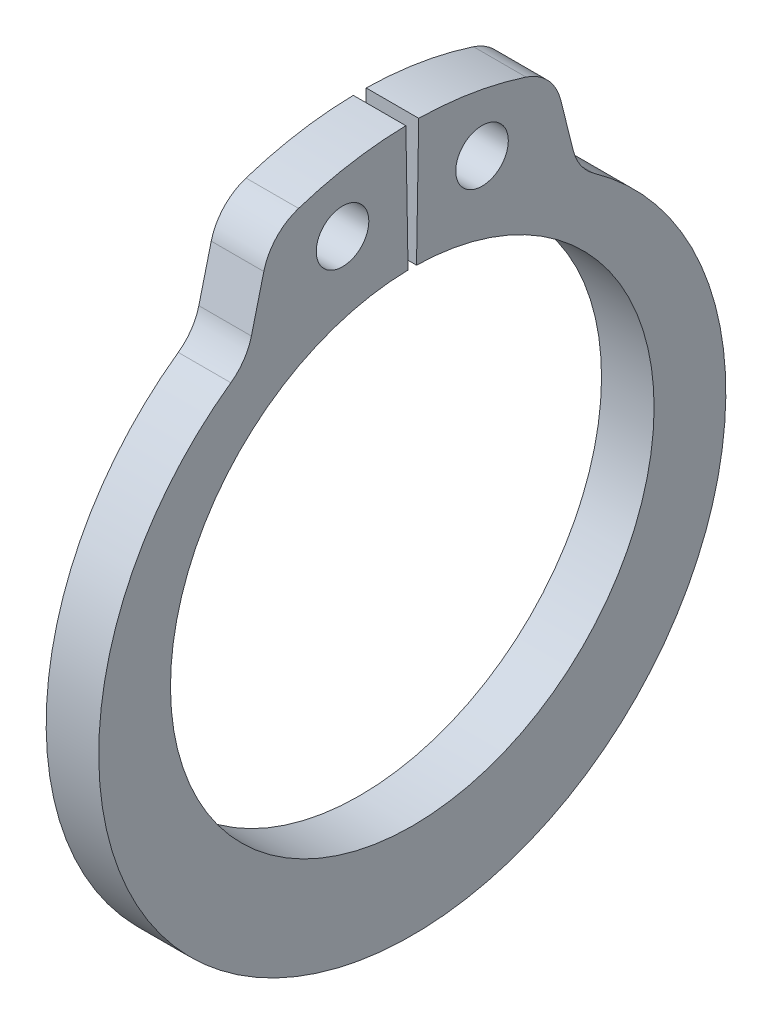
ISO-10303-21;
HEADER;
FILE_DESCRIPTION(('STEP AP214'),'2;1');
FILE_NAME('part.step','',(''),(''),'','','');
FILE_SCHEMA(('AUTOMOTIVE_DESIGN { 1 0 10303 214 1 1 1 1 }'));
ENDSEC;
DATA;
#1=APPLICATION_CONTEXT('core data for automotive mechanical design processes');
#2=APPLICATION_PROTOCOL_DEFINITION('international standard','automotive_design',2000,#1);
#3=PRODUCT_CONTEXT('',#1,'mechanical');
#4=PRODUCT('Part','Part','',(#3));
#5=PRODUCT_RELATED_PRODUCT_CATEGORY('part','',(#4));
#6=PRODUCT_DEFINITION_FORMATION('','',#4);
#7=PRODUCT_DEFINITION_CONTEXT('part definition',#1,'design');
#8=PRODUCT_DEFINITION('design','',#6,#7);
#9=PRODUCT_DEFINITION_SHAPE('','',#8);
#10=(LENGTH_UNIT() NAMED_UNIT(*) SI_UNIT(.MILLI.,.METRE.));
#11=(NAMED_UNIT(*) PLANE_ANGLE_UNIT() SI_UNIT($,.RADIAN.));
#12=(NAMED_UNIT(*) SI_UNIT($,.STERADIAN.) SOLID_ANGLE_UNIT());
#13=UNCERTAINTY_MEASURE_WITH_UNIT(LENGTH_MEASURE(1.E-05),#10,'distance_accuracy_value','');
#14=(GEOMETRIC_REPRESENTATION_CONTEXT(3) GLOBAL_UNCERTAINTY_ASSIGNED_CONTEXT((#13)) GLOBAL_UNIT_ASSIGNED_CONTEXT((#10,
#11,#12)) REPRESENTATION_CONTEXT('',''));
#15=CARTESIAN_POINT('',(0.,0.,0.));
#16=DIRECTION('',(0.,0.,1.));
#17=DIRECTION('',(1.,0.,0.));
#18=AXIS2_PLACEMENT_3D('',#15,#16,#17);
#19=CARTESIAN_POINT('',(0.635,0.,0.));
#20=DIRECTION('',(1.,0.,0.));
#21=DIRECTION('',(0.,0.,-1.));
#22=AXIS2_PLACEMENT_3D('',#19,#20,#21);
#23=PLANE('',#22);
#24=CARTESIAN_POINT('',(0.635,7.33771049478929,1.68498677622097));
#25=DIRECTION('',(1.,0.,0.));
#26=DIRECTION('',(0.,0.,-1.));
#27=AXIS2_PLACEMENT_3D('',#24,#25,#26);
#28=CIRCLE('',#27,0.635);
#29=CARTESIAN_POINT('',(0.635,7.33771049478929,1.04998677622097));
#30=VERTEX_POINT('',#29);
#31=EDGE_CURVE('E218',#30,#30,#28,.T.);
#32=ORIENTED_EDGE('',*,*,#31,.F.);
#33=EDGE_LOOP('',(#32));
#34=FACE_BOUND('',#33,.T.);
#35=CARTESIAN_POINT('',(0.635,0.,0.));
#36=DIRECTION('',(1.,0.,0.));
#37=DIRECTION('',(0.,0.,-1.));
#38=AXIS2_PLACEMENT_3D('',#35,#36,#37);
#39=CIRCLE('',#38,8.88999999999998);
#40=CARTESIAN_POINT('',(0.635,8.88864600994031,0.155151893227452));
#41=VERTEX_POINT('',#40);
#42=CARTESIAN_POINT('',(0.635,8.45481975457244,2.74738474147533));
#43=VERTEX_POINT('',#42);
#44=EDGE_CURVE('E135',#41,#43,#39,.T.);
#45=ORIENTED_EDGE('',*,*,#44,.T.);
#46=CARTESIAN_POINT('',(0.635,7.24698836106209,2.35490120697885));
#47=DIRECTION('',(1.,0.,0.));
#48=DIRECTION('',(0.,0.,-1.));
#49=AXIS2_PLACEMENT_3D('',#46,#47,#48);
#50=CIRCLE('',#49,1.27);
#51=CARTESIAN_POINT('',(0.635,7.55422916847366,3.58717677934937));
#52=VERTEX_POINT('',#51);
#53=EDGE_CURVE('E172',#43,#52,#50,.T.);
#54=ORIENTED_EDGE('',*,*,#53,.T.);
#55=DIRECTION('',(0.,-0.970295726275998,0.241921895599661));
#56=VECTOR('',#55,1.);
#57=CARTESIAN_POINT('',(0.635,8.20363873719473,3.4252607885529));
#58=LINE('',#57,#56);
#59=CARTESIAN_POINT('',(0.635,6.35349195006748,3.88655419195405));
#60=VERTEX_POINT('',#59);
#61=EDGE_CURVE('E210',#52,#60,#58,.T.);
#62=ORIENTED_EDGE('',*,*,#61,.T.);
#63=CARTESIAN_POINT('',(0.635,6.66073275747905,5.11882976432457));
#64=DIRECTION('',(1.,0.,0.));
#65=DIRECTION('',(0.,0.,-1.));
#66=AXIS2_PLACEMENT_3D('',#63,#64,#65);
#67=CIRCLE('',#66,1.27);
#68=CARTESIAN_POINT('',(0.635,5.6250079501203,4.38386437505669));
#69=VERTEX_POINT('',#68);
#70=EDGE_CURVE('E183',#60,#69,#67,.F.);
#71=ORIENTED_EDGE('',*,*,#70,.T.);
#72=CARTESIAN_POINT('',(0.635,-0.552802803479046,0.));
#73=DIRECTION('',(1.,0.,0.));
#74=DIRECTION('',(0.,0.,-1.));
#75=AXIS2_PLACEMENT_3D('',#72,#73,#74);
#76=CIRCLE('',#75,7.57519719652095);
#77=CARTESIAN_POINT('',(0.635,5.62500795012011,-4.38386437505695));
#78=VERTEX_POINT('',#77);
#79=EDGE_CURVE('E205',#69,#78,#76,.T.);
#80=ORIENTED_EDGE('',*,*,#79,.T.);
#81=CARTESIAN_POINT('',(0.635,6.66073275747883,-5.11882976432488));
#82=DIRECTION('',(1.,0.,0.));
#83=DIRECTION('',(0.,0.,-1.));
#84=AXIS2_PLACEMENT_3D('',#81,#82,#83);
#85=CIRCLE('',#84,1.27);
#86=CARTESIAN_POINT('',(0.635,6.35349195006709,-3.8865541919544));
#87=VERTEX_POINT('',#86);
#88=EDGE_CURVE('E11',#78,#87,#85,.F.);
#89=ORIENTED_EDGE('',*,*,#88,.T.);
#90=DIRECTION('',(0.,0.970295726275966,0.24192189559979));
#91=VECTOR('',#90,1.);
#92=CARTESIAN_POINT('',(0.635,8.20363873719474,-3.42526078855289));
#93=LINE('',#92,#91);
#94=CARTESIAN_POINT('',(0.635,7.55422916847373,-3.58717677934944));
#95=VERTEX_POINT('',#94);
#96=EDGE_CURVE('E204',#87,#95,#93,.T.);
#97=ORIENTED_EDGE('',*,*,#96,.T.);
#98=CARTESIAN_POINT('',(0.635,7.24698836106199,-2.35490120697896));
#99=DIRECTION('',(1.,0.,0.));
#100=DIRECTION('',(0.,0.,-1.));
#101=AXIS2_PLACEMENT_3D('',#98,#99,#100);
#102=CIRCLE('',#101,1.27);
#103=CARTESIAN_POINT('',(0.635,8.45481975457237,-2.74738474147536));
#104=VERTEX_POINT('',#103);
#105=EDGE_CURVE('E50',#95,#104,#102,.T.);
#106=ORIENTED_EDGE('',*,*,#105,.T.);
#107=CARTESIAN_POINT('',(0.635,-5.25968157916168E-12,1.06620441642225E-12));
#108=DIRECTION('',(1.,0.,0.));
#109=DIRECTION('',(0.,0.,1.));
#110=AXIS2_PLACEMENT_3D('',#107,#108,#109);
#111=CIRCLE('',#110,8.89000000000527);
#112=CARTESIAN_POINT('',(0.635,8.88864600994031,-0.155151893227453));
#113=VERTEX_POINT('',#112);
#114=EDGE_CURVE('E207',#104,#113,#111,.T.);
#115=ORIENTED_EDGE('',*,*,#114,.T.);
#116=DIRECTION('',(0.,-0.999847695156391,0.0174524064372838));
#117=VECTOR('',#116,1.);
#118=CARTESIAN_POINT('',(0.635,8.88864600994031,-0.155151893227452));
#119=LINE('',#118,#117);
#120=CARTESIAN_POINT('',(0.635,5.84111023510362,-0.101956958406611));
#121=VERTEX_POINT('',#120);
#122=EDGE_CURVE('E141',#113,#121,#119,.T.);
#123=ORIENTED_EDGE('',*,*,#122,.T.);
#124=CARTESIAN_POINT('',(0.635,0.,0.));
#125=DIRECTION('',(-1.,0.,0.));
#126=DIRECTION('',(0.,0.,-1.));
#127=AXIS2_PLACEMENT_3D('',#124,#125,#126);
#128=CIRCLE('',#127,5.84199999999999);
#129=CARTESIAN_POINT('',(0.635,5.84111023510362,0.101956958406611));
#130=VERTEX_POINT('',#129);
#131=EDGE_CURVE('E136',#121,#130,#128,.T.);
#132=ORIENTED_EDGE('',*,*,#131,.T.);
#133=DIRECTION('',(0.,0.999847695156391,0.0174524064372838));
#134=VECTOR('',#133,1.);
#135=CARTESIAN_POINT('',(0.635,5.84111023510362,0.101956958406611));
#136=LINE('',#135,#134);
#137=EDGE_CURVE('E125',#130,#41,#136,.T.);
#138=ORIENTED_EDGE('',*,*,#137,.T.);
#139=EDGE_LOOP('',(#45,#54,#62,#71,#80,#89,#97,#106,#115,#123,#132,#138));
#140=FACE_BOUND('',#139,.T.);
#141=CARTESIAN_POINT('',(0.635,7.33771049478929,-1.68498677622097));
#142=DIRECTION('',(1.,0.,0.));
#143=DIRECTION('',(0.,0.,-1.));
#144=AXIS2_PLACEMENT_3D('',#141,#142,#143);
#145=CIRCLE('',#144,0.635);
#146=CARTESIAN_POINT('',(0.635,7.33771049478929,-2.31998677622097));
#147=VERTEX_POINT('',#146);
#148=EDGE_CURVE('E247',#147,#147,#145,.T.);
#149=ORIENTED_EDGE('',*,*,#148,.F.);
#150=EDGE_LOOP('',(#149));
#151=FACE_BOUND('',#150,.T.);
#152=ADVANCED_FACE('F35',(#34,#140,#151),#23,.T.);
#153=CARTESIAN_POINT('',(-0.635,0.,0.));
#154=DIRECTION('',(1.,0.,0.));
#155=DIRECTION('',(0.,0.,-1.));
#156=AXIS2_PLACEMENT_3D('',#153,#154,#155);
#157=PLANE('',#156);
#158=CARTESIAN_POINT('',(-0.635,7.33771049478929,1.68498677622097));
#159=DIRECTION('',(1.,0.,0.));
#160=DIRECTION('',(0.,0.,-1.));
#161=AXIS2_PLACEMENT_3D('',#158,#159,#160);
#162=CIRCLE('',#161,0.635);
#163=CARTESIAN_POINT('',(-0.635,7.33771049478929,1.04998677622097));
#164=VERTEX_POINT('',#163);
#165=EDGE_CURVE('E244',#164,#164,#162,.T.);
#166=ORIENTED_EDGE('',*,*,#165,.T.);
#167=EDGE_LOOP('',(#166));
#168=FACE_BOUND('',#167,.T.);
#169=DIRECTION('',(0.,-0.970295726275998,0.241921895599661));
#170=VECTOR('',#169,1.);
#171=CARTESIAN_POINT('',(-0.635,8.20363873719473,3.4252607885529));
#172=LINE('',#171,#170);
#173=CARTESIAN_POINT('',(-0.635,7.55422916847366,3.58717677934937));
#174=VERTEX_POINT('',#173);
#175=CARTESIAN_POINT('',(-0.635,6.35349195006748,3.88655419195405));
#176=VERTEX_POINT('',#175);
#177=EDGE_CURVE('E201',#174,#176,#172,.T.);
#178=ORIENTED_EDGE('',*,*,#177,.F.);
#179=CARTESIAN_POINT('',(-0.635,7.24698836106209,2.35490120697885));
#180=DIRECTION('',(1.,0.,0.));
#181=DIRECTION('',(0.,0.,-1.));
#182=AXIS2_PLACEMENT_3D('',#179,#180,#181);
#183=CIRCLE('',#182,1.27);
#184=CARTESIAN_POINT('',(-0.635,8.45481975457244,2.74738474147533));
#185=VERTEX_POINT('',#184);
#186=EDGE_CURVE('E167',#174,#185,#183,.F.);
#187=ORIENTED_EDGE('',*,*,#186,.T.);
#188=CARTESIAN_POINT('',(-0.635,0.,0.));
#189=DIRECTION('',(1.,0.,0.));
#190=DIRECTION('',(0.,0.,-1.));
#191=AXIS2_PLACEMENT_3D('',#188,#189,#190);
#192=CIRCLE('',#191,8.88999999999998);
#193=CARTESIAN_POINT('',(-0.635,8.88864600994031,0.155151893227452));
#194=VERTEX_POINT('',#193);
#195=EDGE_CURVE('E220',#194,#185,#192,.T.);
#196=ORIENTED_EDGE('',*,*,#195,.F.);
#197=DIRECTION('',(0.,0.999847695156391,0.0174524064372838));
#198=VECTOR('',#197,1.);
#199=CARTESIAN_POINT('',(-0.635,5.84111023510362,0.101956958406611));
#200=LINE('',#199,#198);
#201=CARTESIAN_POINT('',(-0.635,5.84111023510362,0.101956958406611));
#202=VERTEX_POINT('',#201);
#203=EDGE_CURVE('E217',#202,#194,#200,.T.);
#204=ORIENTED_EDGE('',*,*,#203,.F.);
#205=CARTESIAN_POINT('',(-0.635,0.,0.));
#206=DIRECTION('',(-1.,0.,0.));
#207=DIRECTION('',(0.,0.,-1.));
#208=AXIS2_PLACEMENT_3D('',#205,#206,#207);
#209=CIRCLE('',#208,5.84199999999999);
#210=CARTESIAN_POINT('',(-0.635,5.84111023510362,-0.101956958406611));
#211=VERTEX_POINT('',#210);
#212=EDGE_CURVE('E149',#211,#202,#209,.T.);
#213=ORIENTED_EDGE('',*,*,#212,.F.);
#214=DIRECTION('',(0.,-0.999847695156391,0.0174524064372838));
#215=VECTOR('',#214,1.);
#216=CARTESIAN_POINT('',(-0.635,8.88864600994031,-0.155151893227452));
#217=LINE('',#216,#215);
#218=CARTESIAN_POINT('',(-0.635,8.88864600994031,-0.155151893227453));
#219=VERTEX_POINT('',#218);
#220=EDGE_CURVE('E145',#219,#211,#217,.T.);
#221=ORIENTED_EDGE('',*,*,#220,.F.);
#222=CARTESIAN_POINT('',(-0.635,-5.25968157916168E-12,1.06620441642225E-12));
#223=DIRECTION('',(1.,0.,0.));
#224=DIRECTION('',(0.,0.,1.));
#225=AXIS2_PLACEMENT_3D('',#222,#223,#224);
#226=CIRCLE('',#225,8.89000000000527);
#227=CARTESIAN_POINT('',(-0.635,8.45481975457237,-2.74738474147536));
#228=VERTEX_POINT('',#227);
#229=EDGE_CURVE('E226',#228,#219,#226,.T.);
#230=ORIENTED_EDGE('',*,*,#229,.F.);
#231=CARTESIAN_POINT('',(-0.635,7.24698836106199,-2.35490120697896));
#232=DIRECTION('',(1.,0.,0.));
#233=DIRECTION('',(0.,0.,-1.));
#234=AXIS2_PLACEMENT_3D('',#231,#232,#233);
#235=CIRCLE('',#234,1.27);
#236=CARTESIAN_POINT('',(-0.635,7.55422916847373,-3.58717677934944));
#237=VERTEX_POINT('',#236);
#238=EDGE_CURVE('E165',#228,#237,#235,.F.);
#239=ORIENTED_EDGE('',*,*,#238,.T.);
#240=DIRECTION('',(0.,0.970295726275966,0.24192189559979));
#241=VECTOR('',#240,1.);
#242=CARTESIAN_POINT('',(-0.635,8.20363873719474,-3.42526078855289));
#243=LINE('',#242,#241);
#244=CARTESIAN_POINT('',(-0.635,6.35349195006709,-3.8865541919544));
#245=VERTEX_POINT('',#244);
#246=EDGE_CURVE('E192',#245,#237,#243,.T.);
#247=ORIENTED_EDGE('',*,*,#246,.F.);
#248=CARTESIAN_POINT('',(-0.635,6.66073275747883,-5.11882976432488));
#249=DIRECTION('',(1.,0.,0.));
#250=DIRECTION('',(0.,0.,-1.));
#251=AXIS2_PLACEMENT_3D('',#248,#249,#250);
#252=CIRCLE('',#251,1.27);
#253=CARTESIAN_POINT('',(-0.635,5.62500795012011,-4.38386437505695));
#254=VERTEX_POINT('',#253);
#255=EDGE_CURVE('E43',#245,#254,#252,.T.);
#256=ORIENTED_EDGE('',*,*,#255,.T.);
#257=CARTESIAN_POINT('',(-0.635,-0.552802803479046,0.));
#258=DIRECTION('',(1.,0.,0.));
#259=DIRECTION('',(0.,0.,-1.));
#260=AXIS2_PLACEMENT_3D('',#257,#258,#259);
#261=CIRCLE('',#260,7.57519719652095);
#262=CARTESIAN_POINT('',(-0.635,5.6250079501203,4.38386437505669));
#263=VERTEX_POINT('',#262);
#264=EDGE_CURVE('E191',#263,#254,#261,.T.);
#265=ORIENTED_EDGE('',*,*,#264,.F.);
#266=CARTESIAN_POINT('',(-0.635,6.66073275747905,5.11882976432457));
#267=DIRECTION('',(1.,0.,0.));
#268=DIRECTION('',(0.,0.,-1.));
#269=AXIS2_PLACEMENT_3D('',#266,#267,#268);
#270=CIRCLE('',#269,1.27);
#271=EDGE_CURVE('E181',#263,#176,#270,.T.);
#272=ORIENTED_EDGE('',*,*,#271,.T.);
#273=EDGE_LOOP('',(#178,#187,#196,#204,#213,#221,#230,#239,#247,#256,#265,#272));
#274=FACE_BOUND('',#273,.T.);
#275=CARTESIAN_POINT('',(-0.635,7.33771049478929,-1.68498677622097));
#276=DIRECTION('',(1.,0.,0.));
#277=DIRECTION('',(0.,0.,-1.));
#278=AXIS2_PLACEMENT_3D('',#275,#276,#277);
#279=CIRCLE('',#278,0.635);
#280=CARTESIAN_POINT('',(-0.635,7.33771049478929,-2.31998677622097));
#281=VERTEX_POINT('',#280);
#282=EDGE_CURVE('E250',#281,#281,#279,.T.);
#283=ORIENTED_EDGE('',*,*,#282,.T.);
#284=EDGE_LOOP('',(#283));
#285=FACE_BOUND('',#284,.T.);
#286=ADVANCED_FACE('F189',(#168,#274,#285),#157,.F.);
#287=CARTESIAN_POINT('',(0.635,0.,0.));
#288=DIRECTION('',(-1.,0.,0.));
#289=DIRECTION('',(0.,0.,1.));
#290=AXIS2_PLACEMENT_3D('',#287,#288,#289);
#291=CYLINDRICAL_SURFACE('',#290,5.84199999999999);
#292=ORIENTED_EDGE('',*,*,#212,.T.);
#293=DIRECTION('',(-1.,0.,0.));
#294=VECTOR('',#293,1.);
#295=CARTESIAN_POINT('',(0.635,5.84111023510362,0.101956958406611));
#296=LINE('',#295,#294);
#297=EDGE_CURVE('E129',#130,#202,#296,.T.);
#298=ORIENTED_EDGE('',*,*,#297,.F.);
#299=ORIENTED_EDGE('',*,*,#131,.F.);
#300=DIRECTION('',(-1.,0.,0.));
#301=VECTOR('',#300,1.);
#302=CARTESIAN_POINT('',(0.635,5.84111023510362,-0.101956958406611));
#303=LINE('',#302,#301);
#304=EDGE_CURVE('E215',#121,#211,#303,.T.);
#305=ORIENTED_EDGE('',*,*,#304,.T.);
#306=EDGE_LOOP('',(#292,#298,#299,#305));
#307=FACE_BOUND('',#306,.T.);
#308=ADVANCED_FACE('F147',(#307),#291,.F.);
#309=CARTESIAN_POINT('',(0.635,5.84111023510362,0.101956958406611));
#310=DIRECTION('',(0.,-0.0174524064372838,0.999847695156391));
#311=DIRECTION('',(0.,-0.999847695156391,-0.0174524064372838));
#312=AXIS2_PLACEMENT_3D('',#309,#310,#311);
#313=PLANE('',#312);
#314=ORIENTED_EDGE('',*,*,#203,.T.);
#315=DIRECTION('',(-1.,0.,0.));
#316=VECTOR('',#315,1.);
#317=CARTESIAN_POINT('',(0.635,8.88864600994031,0.155151893227452));
#318=LINE('',#317,#316);
#319=EDGE_CURVE('E132',#41,#194,#318,.T.);
#320=ORIENTED_EDGE('',*,*,#319,.F.);
#321=ORIENTED_EDGE('',*,*,#137,.F.);
#322=ORIENTED_EDGE('',*,*,#297,.T.);
#323=EDGE_LOOP('',(#314,#320,#321,#322));
#324=FACE_BOUND('',#323,.T.);
#325=ADVANCED_FACE('F127',(#324),#313,.F.);
#326=CARTESIAN_POINT('',(0.635,0.,0.));
#327=DIRECTION('',(-1.,0.,0.));
#328=DIRECTION('',(0.,0.,1.));
#329=AXIS2_PLACEMENT_3D('',#326,#327,#328);
#330=CYLINDRICAL_SURFACE('',#329,8.88999999999998);
#331=ORIENTED_EDGE('',*,*,#195,.T.);
#332=DIRECTION('',(-1.,0.,0.));
#333=VECTOR('',#332,1.);
#334=CARTESIAN_POINT('',(0.635,8.45481975457244,2.74738474147533));
#335=LINE('',#334,#333);
#336=EDGE_CURVE('E169',#185,#43,#335,.F.);
#337=ORIENTED_EDGE('',*,*,#336,.T.);
#338=ORIENTED_EDGE('',*,*,#44,.F.);
#339=ORIENTED_EDGE('',*,*,#319,.T.);
#340=EDGE_LOOP('',(#331,#337,#338,#339));
#341=FACE_BOUND('',#340,.T.);
#342=ADVANCED_FACE('F238',(#341),#330,.T.);
#343=CARTESIAN_POINT('',(0.635,8.20363873719473,3.4252607885529));
#344=DIRECTION('',(0.,-0.241921895599661,-0.970295726275998));
#345=DIRECTION('',(0.,0.970295726275998,-0.241921895599661));
#346=AXIS2_PLACEMENT_3D('',#343,#344,#345);
#347=PLANE('',#346);
#348=ORIENTED_EDGE('',*,*,#177,.T.);
#349=DIRECTION('',(1.,0.,0.));
#350=VECTOR('',#349,1.);
#351=CARTESIAN_POINT('',(0.635,6.35349195006748,3.88655419195405));
#352=LINE('',#351,#350);
#353=EDGE_CURVE('E163',#176,#60,#352,.T.);
#354=ORIENTED_EDGE('',*,*,#353,.T.);
#355=ORIENTED_EDGE('',*,*,#61,.F.);
#356=DIRECTION('',(-1.,0.,0.));
#357=VECTOR('',#356,1.);
#358=CARTESIAN_POINT('',(0.635,7.55422916847366,3.58717677934937));
#359=LINE('',#358,#357);
#360=EDGE_CURVE('E160',#52,#174,#359,.T.);
#361=ORIENTED_EDGE('',*,*,#360,.T.);
#362=EDGE_LOOP('',(#348,#354,#355,#361));
#363=FACE_BOUND('',#362,.T.);
#364=ADVANCED_FACE('F280',(#363),#347,.F.);
#365=CARTESIAN_POINT('',(0.635,-0.552802803479046,0.));
#366=DIRECTION('',(-1.,0.,0.));
#367=DIRECTION('',(0.,0.,1.));
#368=AXIS2_PLACEMENT_3D('',#365,#366,#367);
#369=CYLINDRICAL_SURFACE('',#368,7.57519719652095);
#370=ORIENTED_EDGE('',*,*,#79,.F.);
#371=DIRECTION('',(-1.,0.,0.));
#372=VECTOR('',#371,1.);
#373=CARTESIAN_POINT('',(0.635,5.6250079501203,4.38386437505669));
#374=LINE('',#373,#372);
#375=EDGE_CURVE('E152',#69,#263,#374,.T.);
#376=ORIENTED_EDGE('',*,*,#375,.T.);
#377=ORIENTED_EDGE('',*,*,#264,.T.);
#378=DIRECTION('',(-1.,0.,0.));
#379=VECTOR('',#378,1.);
#380=CARTESIAN_POINT('',(0.635,5.62500795012011,-4.38386437505695));
#381=LINE('',#380,#379);
#382=EDGE_CURVE('E150',#254,#78,#381,.F.);
#383=ORIENTED_EDGE('',*,*,#382,.T.);
#384=EDGE_LOOP('',(#370,#376,#377,#383));
#385=FACE_BOUND('',#384,.T.);
#386=ADVANCED_FACE('F198',(#385),#369,.T.);
#387=CARTESIAN_POINT('',(0.635,8.20363873719474,-3.42526078855289));
#388=DIRECTION('',(0.,-0.241921895599789,0.970295726275966));
#389=DIRECTION('',(0.,-0.970295726275966,-0.24192189559979));
#390=AXIS2_PLACEMENT_3D('',#387,#388,#389);
#391=PLANE('',#390);
#392=ORIENTED_EDGE('',*,*,#246,.T.);
#393=DIRECTION('',(-1.,0.,0.));
#394=VECTOR('',#393,1.);
#395=CARTESIAN_POINT('',(0.635,7.55422916847373,-3.58717677934944));
#396=LINE('',#395,#394);
#397=EDGE_CURVE('E58',#237,#95,#396,.F.);
#398=ORIENTED_EDGE('',*,*,#397,.T.);
#399=ORIENTED_EDGE('',*,*,#96,.F.);
#400=DIRECTION('',(1.,0.,0.));
#401=VECTOR('',#400,1.);
#402=CARTESIAN_POINT('',(-0.635,6.35349195006709,-3.8865541919544));
#403=LINE('',#402,#401);
#404=EDGE_CURVE('E177',#87,#245,#403,.F.);
#405=ORIENTED_EDGE('',*,*,#404,.T.);
#406=EDGE_LOOP('',(#392,#398,#399,#405));
#407=FACE_BOUND('',#406,.T.);
#408=ADVANCED_FACE('F206',(#407),#391,.F.);
#409=CARTESIAN_POINT('',(0.635,-5.25968157916168E-12,1.06620441642225E-12));
#410=DIRECTION('',(-1.,0.,0.));
#411=DIRECTION('',(0.,0.,1.));
#412=AXIS2_PLACEMENT_3D('',#409,#410,#411);
#413=CYLINDRICAL_SURFACE('',#412,8.89000000000527);
#414=ORIENTED_EDGE('',*,*,#114,.F.);
#415=DIRECTION('',(-1.,0.,0.));
#416=VECTOR('',#415,1.);
#417=CARTESIAN_POINT('',(0.635,8.45481975457237,-2.74738474147536));
#418=LINE('',#417,#416);
#419=EDGE_CURVE('E174',#104,#228,#418,.T.);
#420=ORIENTED_EDGE('',*,*,#419,.T.);
#421=ORIENTED_EDGE('',*,*,#229,.T.);
#422=DIRECTION('',(-1.,0.,0.));
#423=VECTOR('',#422,1.);
#424=CARTESIAN_POINT('',(0.635,8.88864600994031,-0.155151893227453));
#425=LINE('',#424,#423);
#426=EDGE_CURVE('E154',#113,#219,#425,.T.);
#427=ORIENTED_EDGE('',*,*,#426,.F.);
#428=EDGE_LOOP('',(#414,#420,#421,#427));
#429=FACE_BOUND('',#428,.T.);
#430=ADVANCED_FACE('F273',(#429),#413,.T.);
#431=CARTESIAN_POINT('',(0.635,8.88864600994031,-0.155151893227452));
#432=DIRECTION('',(0.,-0.0174524064372838,-0.999847695156391));
#433=DIRECTION('',(0.,0.999847695156391,-0.0174524064372838));
#434=AXIS2_PLACEMENT_3D('',#431,#432,#433);
#435=PLANE('',#434);
#436=ORIENTED_EDGE('',*,*,#220,.T.);
#437=ORIENTED_EDGE('',*,*,#304,.F.);
#438=ORIENTED_EDGE('',*,*,#122,.F.);
#439=ORIENTED_EDGE('',*,*,#426,.T.);
#440=EDGE_LOOP('',(#436,#437,#438,#439));
#441=FACE_BOUND('',#440,.T.);
#442=ADVANCED_FACE('F233',(#441),#435,.F.);
#443=CARTESIAN_POINT('',(0.635,7.33771049478929,1.68498677622097));
#444=DIRECTION('',(-1.,0.,0.));
#445=DIRECTION('',(0.,0.,1.));
#446=AXIS2_PLACEMENT_3D('',#443,#444,#445);
#447=CYLINDRICAL_SURFACE('',#446,0.635);
#448=ORIENTED_EDGE('',*,*,#31,.T.);
#449=EDGE_LOOP('',(#448));
#450=FACE_BOUND('',#449,.T.);
#451=ORIENTED_EDGE('',*,*,#165,.F.);
#452=EDGE_LOOP('',(#451));
#453=FACE_BOUND('',#452,.T.);
#454=ADVANCED_FACE('F268',(#450,#453),#447,.F.);
#455=CARTESIAN_POINT('',(0.635,7.33771049478929,-1.68498677622097));
#456=DIRECTION('',(-1.,0.,0.));
#457=DIRECTION('',(0.,0.,1.));
#458=AXIS2_PLACEMENT_3D('',#455,#456,#457);
#459=CYLINDRICAL_SURFACE('',#458,0.635);
#460=ORIENTED_EDGE('',*,*,#148,.T.);
#461=EDGE_LOOP('',(#460));
#462=FACE_BOUND('',#461,.T.);
#463=ORIENTED_EDGE('',*,*,#282,.F.);
#464=EDGE_LOOP('',(#463));
#465=FACE_BOUND('',#464,.T.);
#466=ADVANCED_FACE('F256',(#462,#465),#459,.F.);
#467=CARTESIAN_POINT('',(0.635,6.66073275747905,5.11882976432457));
#468=DIRECTION('',(-1.,0.,0.));
#469=DIRECTION('',(0.,0.,1.));
#470=AXIS2_PLACEMENT_3D('',#467,#468,#469);
#471=CYLINDRICAL_SURFACE('',#470,1.27);
#472=ORIENTED_EDGE('',*,*,#70,.F.);
#473=ORIENTED_EDGE('',*,*,#353,.F.);
#474=ORIENTED_EDGE('',*,*,#271,.F.);
#475=ORIENTED_EDGE('',*,*,#375,.F.);
#476=EDGE_LOOP('',(#472,#473,#474,#475));
#477=FACE_BOUND('',#476,.T.);
#478=ADVANCED_FACE('F290',(#477),#471,.F.);
#479=CARTESIAN_POINT('',(0.635,7.24698836106209,2.35490120697885));
#480=DIRECTION('',(-1.,0.,0.));
#481=DIRECTION('',(0.,0.,1.));
#482=AXIS2_PLACEMENT_3D('',#479,#480,#481);
#483=CYLINDRICAL_SURFACE('',#482,1.27);
#484=ORIENTED_EDGE('',*,*,#53,.F.);
#485=ORIENTED_EDGE('',*,*,#336,.F.);
#486=ORIENTED_EDGE('',*,*,#186,.F.);
#487=ORIENTED_EDGE('',*,*,#360,.F.);
#488=EDGE_LOOP('',(#484,#485,#486,#487));
#489=FACE_BOUND('',#488,.T.);
#490=ADVANCED_FACE('F293',(#489),#483,.T.);
#491=CARTESIAN_POINT('',(0.635,7.24698836106199,-2.35490120697896));
#492=DIRECTION('',(-1.,0.,0.));
#493=DIRECTION('',(0.,0.,1.));
#494=AXIS2_PLACEMENT_3D('',#491,#492,#493);
#495=CYLINDRICAL_SURFACE('',#494,1.27);
#496=ORIENTED_EDGE('',*,*,#105,.F.);
#497=ORIENTED_EDGE('',*,*,#397,.F.);
#498=ORIENTED_EDGE('',*,*,#238,.F.);
#499=ORIENTED_EDGE('',*,*,#419,.F.);
#500=EDGE_LOOP('',(#496,#497,#498,#499));
#501=FACE_BOUND('',#500,.T.);
#502=ADVANCED_FACE('F296',(#501),#495,.T.);
#503=CARTESIAN_POINT('',(0.635,6.66073275747883,-5.11882976432488));
#504=DIRECTION('',(-1.,0.,0.));
#505=DIRECTION('',(0.,0.,1.));
#506=AXIS2_PLACEMENT_3D('',#503,#504,#505);
#507=CYLINDRICAL_SURFACE('',#506,1.27);
#508=ORIENTED_EDGE('',*,*,#88,.F.);
#509=ORIENTED_EDGE('',*,*,#382,.F.);
#510=ORIENTED_EDGE('',*,*,#255,.F.);
#511=ORIENTED_EDGE('',*,*,#404,.F.);
#512=EDGE_LOOP('',(#508,#509,#510,#511));
#513=FACE_BOUND('',#512,.T.);
#514=ADVANCED_FACE('F37',(#513),#507,.F.);
#515=CLOSED_SHELL('',(#152,#286,#308,#325,#342,#364,#386,#408,#430,#442,#454,#466,#478,#490,
#502,#514));
#516=MANIFOLD_SOLID_BREP('B2',#515);
#517=ADVANCED_BREP_SHAPE_REPRESENTATION('',(#18,#516),#14);
#518=SHAPE_DEFINITION_REPRESENTATION(#9,#517);
ENDSEC;
END-ISO-10303-21;
